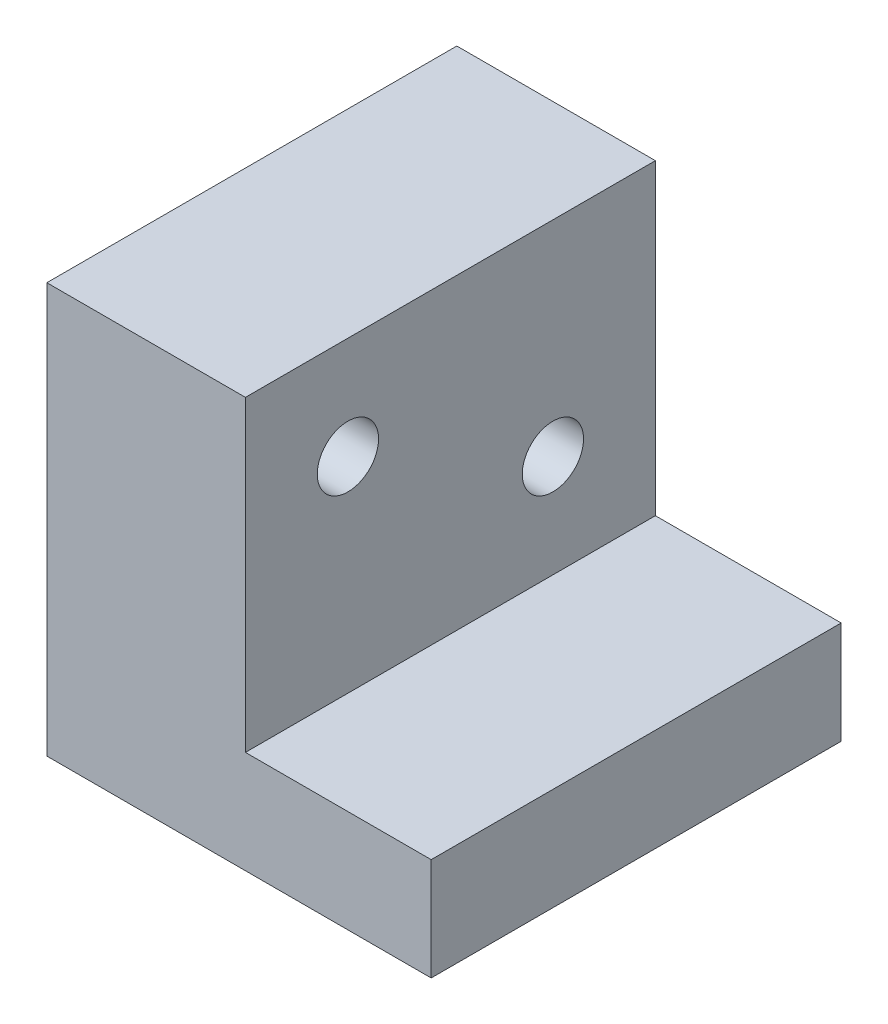
ISO-10303-21;
HEADER;
FILE_DESCRIPTION(('STEP AP214'),'2;1');
FILE_NAME('part.step','',(''),(''),'','','');
FILE_SCHEMA(('AUTOMOTIVE_DESIGN { 1 0 10303 214 1 1 1 1 }'));
ENDSEC;
DATA;
#1=APPLICATION_CONTEXT('core data for automotive mechanical design processes');
#2=APPLICATION_PROTOCOL_DEFINITION('international standard','automotive_design',2000,#1);
#3=PRODUCT_CONTEXT('',#1,'mechanical');
#4=PRODUCT('Part','Part','',(#3));
#5=PRODUCT_RELATED_PRODUCT_CATEGORY('part','',(#4));
#6=PRODUCT_DEFINITION_FORMATION('','',#4);
#7=PRODUCT_DEFINITION_CONTEXT('part definition',#1,'design');
#8=PRODUCT_DEFINITION('design','',#6,#7);
#9=PRODUCT_DEFINITION_SHAPE('','',#8);
#10=(LENGTH_UNIT() NAMED_UNIT(*) SI_UNIT(.MILLI.,.METRE.));
#11=(NAMED_UNIT(*) PLANE_ANGLE_UNIT() SI_UNIT($,.RADIAN.));
#12=(NAMED_UNIT(*) SI_UNIT($,.STERADIAN.) SOLID_ANGLE_UNIT());
#13=UNCERTAINTY_MEASURE_WITH_UNIT(LENGTH_MEASURE(1.E-05),#10,'distance_accuracy_value','');
#14=(GEOMETRIC_REPRESENTATION_CONTEXT(3) GLOBAL_UNCERTAINTY_ASSIGNED_CONTEXT((#13)) GLOBAL_UNIT_ASSIGNED_CONTEXT((#10,
#11,#12)) REPRESENTATION_CONTEXT('',''));
#15=CARTESIAN_POINT('',(0.,0.,0.));
#16=DIRECTION('',(0.,0.,1.));
#17=DIRECTION('',(1.,0.,0.));
#18=AXIS2_PLACEMENT_3D('',#15,#16,#17);
#19=CARTESIAN_POINT('',(-23.8125,12.7,-12.7));
#20=DIRECTION('',(0.,0.,-1.));
#21=DIRECTION('',(0.,1.,0.));
#22=AXIS2_PLACEMENT_3D('',#19,#20,#21);
#23=PLANE('',#22);
#24=DIRECTION('',(0.,-1.,0.));
#25=VECTOR('',#24,1.);
#26=CARTESIAN_POINT('',(-11.509375,12.7,-12.7));
#27=LINE('',#26,#25);
#28=CARTESIAN_POINT('',(-11.509375,12.7,-12.7));
#29=VERTEX_POINT('',#28);
#30=CARTESIAN_POINT('',(-11.509375,-6.35,-12.7));
#31=VERTEX_POINT('',#30);
#32=EDGE_CURVE('E98',#29,#31,#27,.T.);
#33=ORIENTED_EDGE('',*,*,#32,.T.);
#34=DIRECTION('',(1.,0.,0.));
#35=VECTOR('',#34,1.);
#36=CARTESIAN_POINT('',(-11.509375,-6.35,-12.7));
#37=LINE('',#36,#35);
#38=CARTESIAN_POINT('',(0.,-6.35,-12.7));
#39=VERTEX_POINT('',#38);
#40=EDGE_CURVE('E102',#31,#39,#37,.T.);
#41=ORIENTED_EDGE('',*,*,#40,.T.);
#42=DIRECTION('',(0.,1.,0.));
#43=VECTOR('',#42,1.);
#44=CARTESIAN_POINT('',(0.,12.7,-12.7));
#45=LINE('',#44,#43);
#46=CARTESIAN_POINT('',(0.,-12.7,-12.7));
#47=VERTEX_POINT('',#46);
#48=EDGE_CURVE('E117',#47,#39,#45,.T.);
#49=ORIENTED_EDGE('',*,*,#48,.F.);
#50=DIRECTION('',(1.,0.,0.));
#51=VECTOR('',#50,1.);
#52=CARTESIAN_POINT('',(-23.8125,-12.7,-12.7));
#53=LINE('',#52,#51);
#54=CARTESIAN_POINT('',(-23.8125,-12.7,-12.7));
#55=VERTEX_POINT('',#54);
#56=EDGE_CURVE('E11',#55,#47,#53,.T.);
#57=ORIENTED_EDGE('',*,*,#56,.F.);
#58=DIRECTION('',(0.,1.,0.));
#59=VECTOR('',#58,1.);
#60=CARTESIAN_POINT('',(-23.8125,12.7,-12.7));
#61=LINE('',#60,#59);
#62=CARTESIAN_POINT('',(-23.8125,12.7,-12.7));
#63=VERTEX_POINT('',#62);
#64=EDGE_CURVE('E119',#55,#63,#61,.T.);
#65=ORIENTED_EDGE('',*,*,#64,.T.);
#66=DIRECTION('',(1.,0.,0.));
#67=VECTOR('',#66,1.);
#68=CARTESIAN_POINT('',(-23.8125,12.7,-12.7));
#69=LINE('',#68,#67);
#70=EDGE_CURVE('E37',#63,#29,#69,.T.);
#71=ORIENTED_EDGE('',*,*,#70,.T.);
#72=EDGE_LOOP('',(#33,#41,#49,#57,#65,#71));
#73=FACE_BOUND('',#72,.T.);
#74=ADVANCED_FACE('F34',(#73),#23,.T.);
#75=CARTESIAN_POINT('',(-23.8125,-12.7,12.7));
#76=DIRECTION('',(0.,-1.,0.));
#77=DIRECTION('',(0.,0.,-1.));
#78=AXIS2_PLACEMENT_3D('',#75,#76,#77);
#79=PLANE('',#78);
#80=DIRECTION('',(0.,0.,-1.));
#81=VECTOR('',#80,1.);
#82=CARTESIAN_POINT('',(0.,-12.7,12.7));
#83=LINE('',#82,#81);
#84=CARTESIAN_POINT('',(0.,-12.7,12.7));
#85=VERTEX_POINT('',#84);
#86=EDGE_CURVE('E122',#85,#47,#83,.T.);
#87=ORIENTED_EDGE('',*,*,#86,.F.);
#88=DIRECTION('',(1.,0.,0.));
#89=VECTOR('',#88,1.);
#90=CARTESIAN_POINT('',(-23.8125,-12.7,12.7));
#91=LINE('',#90,#89);
#92=CARTESIAN_POINT('',(-23.8125,-12.7,12.7));
#93=VERTEX_POINT('',#92);
#94=EDGE_CURVE('E42',#93,#85,#91,.T.);
#95=ORIENTED_EDGE('',*,*,#94,.F.);
#96=DIRECTION('',(0.,0.,-1.));
#97=VECTOR('',#96,1.);
#98=CARTESIAN_POINT('',(-23.8125,-12.7,12.7));
#99=LINE('',#98,#97);
#100=EDGE_CURVE('E127',#93,#55,#99,.T.);
#101=ORIENTED_EDGE('',*,*,#100,.T.);
#102=ORIENTED_EDGE('',*,*,#56,.T.);
#103=EDGE_LOOP('',(#87,#95,#101,#102));
#104=FACE_BOUND('',#103,.T.);
#105=ADVANCED_FACE('F144',(#104),#79,.T.);
#106=CARTESIAN_POINT('',(-23.8125,12.7,12.7));
#107=DIRECTION('',(0.,0.,1.));
#108=DIRECTION('',(0.,-1.,0.));
#109=AXIS2_PLACEMENT_3D('',#106,#107,#108);
#110=PLANE('',#109);
#111=DIRECTION('',(0.,-1.,0.));
#112=VECTOR('',#111,1.);
#113=CARTESIAN_POINT('',(-11.509375,12.7,12.7));
#114=LINE('',#113,#112);
#115=CARTESIAN_POINT('',(-11.509375,12.7,12.7));
#116=VERTEX_POINT('',#115);
#117=CARTESIAN_POINT('',(-11.509375,-6.35,12.7));
#118=VERTEX_POINT('',#117);
#119=EDGE_CURVE('E100',#116,#118,#114,.T.);
#120=ORIENTED_EDGE('',*,*,#119,.F.);
#121=DIRECTION('',(1.,0.,0.));
#122=VECTOR('',#121,1.);
#123=CARTESIAN_POINT('',(-23.8125,12.7,12.7));
#124=LINE('',#123,#122);
#125=CARTESIAN_POINT('',(-23.8125,12.7,12.7));
#126=VERTEX_POINT('',#125);
#127=EDGE_CURVE('E135',#126,#116,#124,.T.);
#128=ORIENTED_EDGE('',*,*,#127,.F.);
#129=DIRECTION('',(0.,-1.,0.));
#130=VECTOR('',#129,1.);
#131=CARTESIAN_POINT('',(-23.8125,12.7,12.7));
#132=LINE('',#131,#130);
#133=EDGE_CURVE('E124',#126,#93,#132,.T.);
#134=ORIENTED_EDGE('',*,*,#133,.T.);
#135=ORIENTED_EDGE('',*,*,#94,.T.);
#136=DIRECTION('',(0.,-1.,0.));
#137=VECTOR('',#136,1.);
#138=CARTESIAN_POINT('',(0.,12.7,12.7));
#139=LINE('',#138,#137);
#140=CARTESIAN_POINT('',(0.,-6.34999999999999,12.7));
#141=VERTEX_POINT('',#140);
#142=EDGE_CURVE('E130',#141,#85,#139,.T.);
#143=ORIENTED_EDGE('',*,*,#142,.F.);
#144=DIRECTION('',(1.,0.,0.));
#145=VECTOR('',#144,1.);
#146=CARTESIAN_POINT('',(-11.509375,-6.35,12.7));
#147=LINE('',#146,#145);
#148=EDGE_CURVE('E50',#118,#141,#147,.T.);
#149=ORIENTED_EDGE('',*,*,#148,.F.);
#150=EDGE_LOOP('',(#120,#128,#134,#135,#143,#149));
#151=FACE_BOUND('',#150,.T.);
#152=ADVANCED_FACE('F140',(#151),#110,.T.);
#153=CARTESIAN_POINT('',(-23.8125,12.7,12.7));
#154=DIRECTION('',(0.,1.,0.));
#155=DIRECTION('',(0.,0.,1.));
#156=AXIS2_PLACEMENT_3D('',#153,#154,#155);
#157=PLANE('',#156);
#158=DIRECTION('',(0.,0.,1.));
#159=VECTOR('',#158,1.);
#160=CARTESIAN_POINT('',(-11.509375,12.7,-12.7));
#161=LINE('',#160,#159);
#162=EDGE_CURVE('E115',#29,#116,#161,.T.);
#163=ORIENTED_EDGE('',*,*,#162,.F.);
#164=ORIENTED_EDGE('',*,*,#70,.F.);
#165=DIRECTION('',(0.,0.,1.));
#166=VECTOR('',#165,1.);
#167=CARTESIAN_POINT('',(-23.8125,12.7,12.7));
#168=LINE('',#167,#166);
#169=EDGE_CURVE('E121',#63,#126,#168,.T.);
#170=ORIENTED_EDGE('',*,*,#169,.T.);
#171=ORIENTED_EDGE('',*,*,#127,.T.);
#172=EDGE_LOOP('',(#163,#164,#170,#171));
#173=FACE_BOUND('',#172,.T.);
#174=ADVANCED_FACE('F137',(#173),#157,.T.);
#175=CARTESIAN_POINT('',(-23.8125,-12.7,-12.7));
#176=DIRECTION('',(1.,0.,0.));
#177=DIRECTION('',(0.,0.,-1.));
#178=AXIS2_PLACEMENT_3D('',#175,#176,#177);
#179=PLANE('',#178);
#180=CARTESIAN_POINT('',(-23.8125,0.,-6.34999999999999));
#181=DIRECTION('',(1.,0.,0.));
#182=DIRECTION('',(0.,0.,-1.));
#183=AXIS2_PLACEMENT_3D('',#180,#181,#182);
#184=CIRCLE('',#183,1.89865);
#185=CARTESIAN_POINT('',(-23.8125,0.,-8.24864999999999));
#186=VERTEX_POINT('',#185);
#187=EDGE_CURVE('E213',#186,#186,#184,.T.);
#188=ORIENTED_EDGE('',*,*,#187,.T.);
#189=EDGE_LOOP('',(#188));
#190=FACE_BOUND('',#189,.T.);
#191=CARTESIAN_POINT('',(-23.8125,6.35,6.34999999999999));
#192=DIRECTION('',(1.,0.,0.));
#193=DIRECTION('',(0.,0.,-1.));
#194=AXIS2_PLACEMENT_3D('',#191,#192,#193);
#195=CIRCLE('',#194,1.89865);
#196=CARTESIAN_POINT('',(-23.8125,6.35,4.45135));
#197=VERTEX_POINT('',#196);
#198=EDGE_CURVE('E217',#197,#197,#195,.T.);
#199=ORIENTED_EDGE('',*,*,#198,.T.);
#200=EDGE_LOOP('',(#199));
#201=FACE_BOUND('',#200,.T.);
#202=ORIENTED_EDGE('',*,*,#64,.F.);
#203=ORIENTED_EDGE('',*,*,#100,.F.);
#204=ORIENTED_EDGE('',*,*,#133,.F.);
#205=ORIENTED_EDGE('',*,*,#169,.F.);
#206=EDGE_LOOP('',(#202,#203,#204,#205));
#207=FACE_BOUND('',#206,.T.);
#208=ADVANCED_FACE('F143',(#190,#201,#207),#179,.F.);
#209=CARTESIAN_POINT('',(0.,-12.7,-12.7));
#210=DIRECTION('',(1.,0.,0.));
#211=DIRECTION('',(0.,0.,-1.));
#212=AXIS2_PLACEMENT_3D('',#209,#210,#211);
#213=PLANE('',#212);
#214=DIRECTION('',(0.,0.,1.));
#215=VECTOR('',#214,1.);
#216=CARTESIAN_POINT('',(0.,-6.35,-12.7));
#217=LINE('',#216,#215);
#218=EDGE_CURVE('E101',#39,#141,#217,.T.);
#219=ORIENTED_EDGE('',*,*,#218,.T.);
#220=ORIENTED_EDGE('',*,*,#142,.T.);
#221=ORIENTED_EDGE('',*,*,#86,.T.);
#222=ORIENTED_EDGE('',*,*,#48,.T.);
#223=EDGE_LOOP('',(#219,#220,#221,#222));
#224=FACE_BOUND('',#223,.T.);
#225=ADVANCED_FACE('F147',(#224),#213,.T.);
#226=CARTESIAN_POINT('',(-11.509375,12.7,-12.7));
#227=DIRECTION('',(-1.,0.,0.));
#228=DIRECTION('',(0.,-1.,0.));
#229=AXIS2_PLACEMENT_3D('',#226,#227,#228);
#230=PLANE('',#229);
#231=CARTESIAN_POINT('',(-11.509375,0.,-6.34999999999999));
#232=DIRECTION('',(-1.,0.,0.));
#233=DIRECTION('',(0.,-1.,0.));
#234=AXIS2_PLACEMENT_3D('',#231,#232,#233);
#235=CIRCLE('',#234,1.89864999999999);
#236=CARTESIAN_POINT('',(-11.509375,-1.89864999999999,-6.34999999999999));
#237=VERTEX_POINT('',#236);
#238=EDGE_CURVE('E216',#237,#237,#235,.T.);
#239=ORIENTED_EDGE('',*,*,#238,.T.);
#240=EDGE_LOOP('',(#239));
#241=FACE_BOUND('',#240,.T.);
#242=CARTESIAN_POINT('',(-11.509375,6.35,6.34999999999999));
#243=DIRECTION('',(-1.,0.,0.));
#244=DIRECTION('',(0.,-1.,0.));
#245=AXIS2_PLACEMENT_3D('',#242,#243,#244);
#246=CIRCLE('',#245,1.89864999999999);
#247=CARTESIAN_POINT('',(-11.509375,4.45135000000001,6.34999999999999));
#248=VERTEX_POINT('',#247);
#249=EDGE_CURVE('E111',#248,#248,#246,.T.);
#250=ORIENTED_EDGE('',*,*,#249,.T.);
#251=EDGE_LOOP('',(#250));
#252=FACE_BOUND('',#251,.T.);
#253=ORIENTED_EDGE('',*,*,#119,.T.);
#254=DIRECTION('',(0.,0.,1.));
#255=VECTOR('',#254,1.);
#256=CARTESIAN_POINT('',(-11.509375,-6.35,-12.7));
#257=LINE('',#256,#255);
#258=EDGE_CURVE('E94',#31,#118,#257,.T.);
#259=ORIENTED_EDGE('',*,*,#258,.F.);
#260=ORIENTED_EDGE('',*,*,#32,.F.);
#261=ORIENTED_EDGE('',*,*,#162,.T.);
#262=EDGE_LOOP('',(#253,#259,#260,#261));
#263=FACE_BOUND('',#262,.T.);
#264=ADVANCED_FACE('F96',(#241,#252,#263),#230,.F.);
#265=CARTESIAN_POINT('',(-11.509375,-6.35,-12.7));
#266=DIRECTION('',(0.,-1.,0.));
#267=DIRECTION('',(0.,0.,-1.));
#268=AXIS2_PLACEMENT_3D('',#265,#266,#267);
#269=PLANE('',#268);
#270=ORIENTED_EDGE('',*,*,#148,.T.);
#271=ORIENTED_EDGE('',*,*,#218,.F.);
#272=ORIENTED_EDGE('',*,*,#40,.F.);
#273=ORIENTED_EDGE('',*,*,#258,.T.);
#274=EDGE_LOOP('',(#270,#271,#272,#273));
#275=FACE_BOUND('',#274,.T.);
#276=ADVANCED_FACE('F105',(#275),#269,.F.);
#277=CARTESIAN_POINT('',(0.,6.35,6.34999999999999));
#278=DIRECTION('',(1.,0.,0.));
#279=DIRECTION('',(0.,0.,-1.));
#280=AXIS2_PLACEMENT_3D('',#277,#278,#279);
#281=CYLINDRICAL_SURFACE('',#280,1.89864999999999);
#282=ORIENTED_EDGE('',*,*,#198,.F.);
#283=EDGE_LOOP('',(#282));
#284=FACE_BOUND('',#283,.T.);
#285=ORIENTED_EDGE('',*,*,#249,.F.);
#286=EDGE_LOOP('',(#285));
#287=FACE_BOUND('',#286,.T.);
#288=ADVANCED_FACE('F189',(#284,#287),#281,.F.);
#289=CARTESIAN_POINT('',(0.,0.,-6.34999999999999));
#290=DIRECTION('',(1.,0.,0.));
#291=DIRECTION('',(0.,0.,-1.));
#292=AXIS2_PLACEMENT_3D('',#289,#290,#291);
#293=CYLINDRICAL_SURFACE('',#292,1.89864999999999);
#294=ORIENTED_EDGE('',*,*,#187,.F.);
#295=EDGE_LOOP('',(#294));
#296=FACE_BOUND('',#295,.T.);
#297=ORIENTED_EDGE('',*,*,#238,.F.);
#298=EDGE_LOOP('',(#297));
#299=FACE_BOUND('',#298,.T.);
#300=ADVANCED_FACE('F197',(#296,#299),#293,.F.);
#301=CLOSED_SHELL('',(#74,#105,#152,#174,#208,#225,#264,#276,#288,#300));
#302=MANIFOLD_SOLID_BREP('B2',#301);
#303=ADVANCED_BREP_SHAPE_REPRESENTATION('',(#18,#302),#14);
#304=SHAPE_DEFINITION_REPRESENTATION(#9,#303);
ENDSEC;
END-ISO-10303-21;
